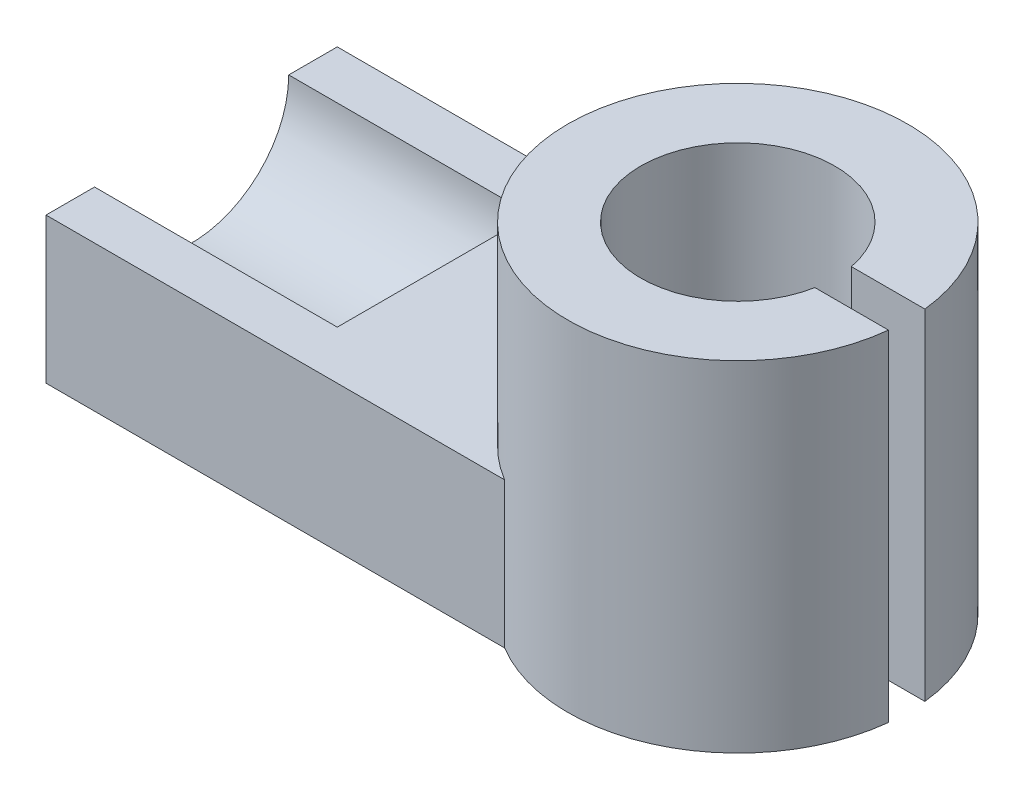
ISO-10303-21;
HEADER;
FILE_DESCRIPTION(('STEP AP214'),'2;1');
FILE_NAME('part.step','',(''),(''),'','','');
FILE_SCHEMA(('AUTOMOTIVE_DESIGN { 1 0 10303 214 1 1 1 1 }'));
ENDSEC;
DATA;
#1=APPLICATION_CONTEXT('core data for automotive mechanical design processes');
#2=APPLICATION_PROTOCOL_DEFINITION('international standard','automotive_design',2000,#1);
#3=PRODUCT_CONTEXT('',#1,'mechanical');
#4=PRODUCT('Part','Part','',(#3));
#5=PRODUCT_RELATED_PRODUCT_CATEGORY('part','',(#4));
#6=PRODUCT_DEFINITION_FORMATION('','',#4);
#7=PRODUCT_DEFINITION_CONTEXT('part definition',#1,'design');
#8=PRODUCT_DEFINITION('design','',#6,#7);
#9=PRODUCT_DEFINITION_SHAPE('','',#8);
#10=(LENGTH_UNIT() NAMED_UNIT(*) SI_UNIT(.MILLI.,.METRE.));
#11=(NAMED_UNIT(*) PLANE_ANGLE_UNIT() SI_UNIT($,.RADIAN.));
#12=(NAMED_UNIT(*) SI_UNIT($,.STERADIAN.) SOLID_ANGLE_UNIT());
#13=UNCERTAINTY_MEASURE_WITH_UNIT(LENGTH_MEASURE(1.E-05),#10,'distance_accuracy_value','');
#14=(GEOMETRIC_REPRESENTATION_CONTEXT(3) GLOBAL_UNCERTAINTY_ASSIGNED_CONTEXT((#13)) GLOBAL_UNIT_ASSIGNED_CONTEXT((#10,
#11,#12)) REPRESENTATION_CONTEXT('',''));
#15=CARTESIAN_POINT('',(0.,0.,0.));
#16=DIRECTION('',(0.,0.,1.));
#17=DIRECTION('',(1.,0.,0.));
#18=AXIS2_PLACEMENT_3D('',#15,#16,#17);
#19=CARTESIAN_POINT('',(0.,56.,-3.));
#20=DIRECTION('',(0.,0.,-1.));
#21=DIRECTION('',(-1.,0.,0.));
#22=AXIS2_PLACEMENT_3D('',#19,#20,#21);
#23=PLANE('',#22);
#24=DIRECTION('',(1.,0.,0.));
#25=VECTOR('',#24,1.);
#26=CARTESIAN_POINT('',(0.,0.,-3.));
#27=LINE('',#26,#25);
#28=CARTESIAN_POINT('',(15.7162336455017,0.,-3.));
#29=VERTEX_POINT('',#28);
#30=CARTESIAN_POINT('',(27.8388218141501,0.,-3.));
#31=VERTEX_POINT('',#30);
#32=EDGE_CURVE('E148',#29,#31,#27,.T.);
#33=ORIENTED_EDGE('',*,*,#32,.T.);
#34=DIRECTION('',(0.,-1.,0.));
#35=VECTOR('',#34,1.);
#36=CARTESIAN_POINT('',(27.8388218141501,56.,-3.));
#37=LINE('',#36,#35);
#38=CARTESIAN_POINT('',(27.8388218141501,56.,-3.));
#39=VERTEX_POINT('',#38);
#40=EDGE_CURVE('E183',#39,#31,#37,.T.);
#41=ORIENTED_EDGE('',*,*,#40,.F.);
#42=DIRECTION('',(1.,0.,0.));
#43=VECTOR('',#42,1.);
#44=CARTESIAN_POINT('',(0.,56.,-3.));
#45=LINE('',#44,#43);
#46=CARTESIAN_POINT('',(15.7162336455017,56.,-3.));
#47=VERTEX_POINT('',#46);
#48=EDGE_CURVE('E154',#47,#39,#45,.T.);
#49=ORIENTED_EDGE('',*,*,#48,.F.);
#50=DIRECTION('',(0.,-1.,0.));
#51=VECTOR('',#50,1.);
#52=CARTESIAN_POINT('',(15.7162336455017,56.,-3.));
#53=LINE('',#52,#51);
#54=EDGE_CURVE('E166',#47,#29,#53,.T.);
#55=ORIENTED_EDGE('',*,*,#54,.T.);
#56=EDGE_LOOP('',(#33,#41,#49,#55));
#57=FACE_BOUND('',#56,.T.);
#58=ADVANCED_FACE('F33',(#57),#23,.F.);
#59=CARTESIAN_POINT('',(0.,56.,0.));
#60=DIRECTION('',(0.,-1.,0.));
#61=DIRECTION('',(0.,0.,-1.));
#62=AXIS2_PLACEMENT_3D('',#59,#60,#61);
#63=CYLINDRICAL_SURFACE('',#62,28.);
#64=CARTESIAN_POINT('',(0.,24.,0.));
#65=DIRECTION('',(0.,1.,0.));
#66=DIRECTION('',(0.,0.,-1.));
#67=AXIS2_PLACEMENT_3D('',#64,#65,#66);
#68=CIRCLE('',#67,28.);
#69=CARTESIAN_POINT('',(-14.4222051018559,24.,-24.));
#70=VERTEX_POINT('',#69);
#71=CARTESIAN_POINT('',(-14.4222051018559,24.,24.));
#72=VERTEX_POINT('',#71);
#73=EDGE_CURVE('E130',#70,#72,#68,.T.);
#74=ORIENTED_EDGE('',*,*,#73,.T.);
#75=DIRECTION('',(0.,-1.,0.));
#76=VECTOR('',#75,1.);
#77=CARTESIAN_POINT('',(-14.4222051018559,24.,24.));
#78=LINE('',#77,#76);
#79=CARTESIAN_POINT('',(-14.4222051018559,0.,24.));
#80=VERTEX_POINT('',#79);
#81=EDGE_CURVE('E149',#72,#80,#78,.T.);
#82=ORIENTED_EDGE('',*,*,#81,.T.);
#83=CARTESIAN_POINT('',(0.,0.,0.));
#84=DIRECTION('',(0.,1.,0.));
#85=DIRECTION('',(0.,0.,1.));
#86=AXIS2_PLACEMENT_3D('',#83,#84,#85);
#87=CIRCLE('',#86,28.);
#88=CARTESIAN_POINT('',(27.8388218141501,0.,3.));
#89=VERTEX_POINT('',#88);
#90=EDGE_CURVE('E169',#80,#89,#87,.T.);
#91=ORIENTED_EDGE('',*,*,#90,.T.);
#92=DIRECTION('',(0.,-1.,0.));
#93=VECTOR('',#92,1.);
#94=CARTESIAN_POINT('',(27.8388218141501,56.,3.));
#95=LINE('',#94,#93);
#96=CARTESIAN_POINT('',(27.8388218141501,56.,3.));
#97=VERTEX_POINT('',#96);
#98=EDGE_CURVE('E180',#97,#89,#95,.T.);
#99=ORIENTED_EDGE('',*,*,#98,.F.);
#100=CARTESIAN_POINT('',(0.,56.,0.));
#101=DIRECTION('',(0.,1.,0.));
#102=DIRECTION('',(0.,0.,1.));
#103=AXIS2_PLACEMENT_3D('',#100,#101,#102);
#104=CIRCLE('',#103,28.);
#105=EDGE_CURVE('E157',#39,#97,#104,.T.);
#106=ORIENTED_EDGE('',*,*,#105,.F.);
#107=ORIENTED_EDGE('',*,*,#40,.T.);
#108=CARTESIAN_POINT('',(-14.4222051018559,0.,-24.));
#109=VERTEX_POINT('',#108);
#110=EDGE_CURVE('E170',#31,#109,#87,.T.);
#111=ORIENTED_EDGE('',*,*,#110,.T.);
#112=DIRECTION('',(0.,-1.,0.));
#113=VECTOR('',#112,1.);
#114=CARTESIAN_POINT('',(-14.4222051018559,24.,-24.));
#115=LINE('',#114,#113);
#116=EDGE_CURVE('E54',#70,#109,#115,.T.);
#117=ORIENTED_EDGE('',*,*,#116,.F.);
#118=EDGE_LOOP('',(#74,#82,#91,#99,#106,#107,#111,#117));
#119=FACE_BOUND('',#118,.T.);
#120=ADVANCED_FACE('F198',(#119),#63,.T.);
#121=CARTESIAN_POINT('',(0.,56.,3.));
#122=DIRECTION('',(0.,0.,-1.));
#123=DIRECTION('',(-1.,0.,0.));
#124=AXIS2_PLACEMENT_3D('',#121,#122,#123);
#125=PLANE('',#124);
#126=DIRECTION('',(1.,0.,0.));
#127=VECTOR('',#126,1.);
#128=CARTESIAN_POINT('',(0.,0.,3.));
#129=LINE('',#128,#127);
#130=CARTESIAN_POINT('',(15.7162336455017,0.,3.));
#131=VERTEX_POINT('',#130);
#132=EDGE_CURVE('E172',#131,#89,#129,.T.);
#133=ORIENTED_EDGE('',*,*,#132,.F.);
#134=DIRECTION('',(0.,-1.,0.));
#135=VECTOR('',#134,1.);
#136=CARTESIAN_POINT('',(15.7162336455017,56.,3.));
#137=LINE('',#136,#135);
#138=CARTESIAN_POINT('',(15.7162336455017,56.,3.));
#139=VERTEX_POINT('',#138);
#140=EDGE_CURVE('E178',#139,#131,#137,.T.);
#141=ORIENTED_EDGE('',*,*,#140,.F.);
#142=DIRECTION('',(1.,0.,0.));
#143=VECTOR('',#142,1.);
#144=CARTESIAN_POINT('',(0.,56.,3.));
#145=LINE('',#144,#143);
#146=EDGE_CURVE('E160',#139,#97,#145,.T.);
#147=ORIENTED_EDGE('',*,*,#146,.T.);
#148=ORIENTED_EDGE('',*,*,#98,.T.);
#149=EDGE_LOOP('',(#133,#141,#147,#148));
#150=FACE_BOUND('',#149,.T.);
#151=ADVANCED_FACE('F202',(#150),#125,.T.);
#152=CARTESIAN_POINT('',(0.,56.,0.));
#153=DIRECTION('',(0.,-1.,0.));
#154=DIRECTION('',(0.,0.,-1.));
#155=AXIS2_PLACEMENT_3D('',#152,#153,#154);
#156=CYLINDRICAL_SURFACE('',#155,16.);
#157=CARTESIAN_POINT('',(0.,0.,0.));
#158=DIRECTION('',(0.,1.,0.));
#159=DIRECTION('',(0.,0.,1.));
#160=AXIS2_PLACEMENT_3D('',#157,#158,#159);
#161=CIRCLE('',#160,16.);
#162=EDGE_CURVE('E158',#29,#131,#161,.T.);
#163=ORIENTED_EDGE('',*,*,#162,.F.);
#164=ORIENTED_EDGE('',*,*,#54,.F.);
#165=CARTESIAN_POINT('',(0.,56.,0.));
#166=DIRECTION('',(0.,1.,0.));
#167=DIRECTION('',(0.,0.,1.));
#168=AXIS2_PLACEMENT_3D('',#165,#166,#167);
#169=CIRCLE('',#168,16.);
#170=EDGE_CURVE('E163',#47,#139,#169,.T.);
#171=ORIENTED_EDGE('',*,*,#170,.T.);
#172=ORIENTED_EDGE('',*,*,#140,.T.);
#173=EDGE_LOOP('',(#163,#164,#171,#172));
#174=FACE_BOUND('',#173,.T.);
#175=ADVANCED_FACE('F206',(#174),#156,.F.);
#176=CARTESIAN_POINT('',(0.,56.,0.));
#177=DIRECTION('',(0.,1.,0.));
#178=DIRECTION('',(0.,0.,1.));
#179=AXIS2_PLACEMENT_3D('',#176,#177,#178);
#180=PLANE('',#179);
#181=ORIENTED_EDGE('',*,*,#48,.T.);
#182=ORIENTED_EDGE('',*,*,#105,.T.);
#183=ORIENTED_EDGE('',*,*,#146,.F.);
#184=ORIENTED_EDGE('',*,*,#170,.F.);
#185=EDGE_LOOP('',(#181,#182,#183,#184));
#186=FACE_BOUND('',#185,.T.);
#187=ADVANCED_FACE('F210',(#186),#180,.T.);
#188=CARTESIAN_POINT('',(0.,0.,0.));
#189=DIRECTION('',(0.,1.,0.));
#190=DIRECTION('',(0.,0.,1.));
#191=AXIS2_PLACEMENT_3D('',#188,#189,#190);
#192=PLANE('',#191);
#193=ORIENTED_EDGE('',*,*,#32,.F.);
#194=ORIENTED_EDGE('',*,*,#162,.T.);
#195=ORIENTED_EDGE('',*,*,#132,.T.);
#196=ORIENTED_EDGE('',*,*,#90,.F.);
#197=DIRECTION('',(-1.,0.,0.));
#198=VECTOR('',#197,1.);
#199=CARTESIAN_POINT('',(-90.,0.,24.));
#200=LINE('',#199,#198);
#201=CARTESIAN_POINT('',(-90.,0.,24.));
#202=VERTEX_POINT('',#201);
#203=EDGE_CURVE('E132',#80,#202,#200,.T.);
#204=ORIENTED_EDGE('',*,*,#203,.T.);
#205=DIRECTION('',(0.,0.,-1.));
#206=VECTOR('',#205,1.);
#207=CARTESIAN_POINT('',(-90.,0.,-24.));
#208=LINE('',#207,#206);
#209=CARTESIAN_POINT('',(-90.,0.,-24.));
#210=VERTEX_POINT('',#209);
#211=EDGE_CURVE('E139',#202,#210,#208,.T.);
#212=ORIENTED_EDGE('',*,*,#211,.T.);
#213=DIRECTION('',(1.,0.,0.));
#214=VECTOR('',#213,1.);
#215=CARTESIAN_POINT('',(-90.,0.,-24.));
#216=LINE('',#215,#214);
#217=EDGE_CURVE('E142',#210,#109,#216,.T.);
#218=ORIENTED_EDGE('',*,*,#217,.T.);
#219=ORIENTED_EDGE('',*,*,#110,.F.);
#220=EDGE_LOOP('',(#193,#194,#195,#196,#204,#212,#218,#219));
#221=FACE_BOUND('',#220,.T.);
#222=ADVANCED_FACE('F193',(#221),#192,.F.);
#223=CARTESIAN_POINT('',(-90.,24.,-24.));
#224=DIRECTION('',(-1.,0.,0.));
#225=DIRECTION('',(0.,0.,1.));
#226=AXIS2_PLACEMENT_3D('',#223,#224,#225);
#227=PLANE('',#226);
#228=CARTESIAN_POINT('',(-90.,24.,0.));
#229=DIRECTION('',(-1.,0.,0.));
#230=DIRECTION('',(0.,0.,1.));
#231=AXIS2_PLACEMENT_3D('',#228,#229,#230);
#232=CIRCLE('',#231,16.);
#233=CARTESIAN_POINT('',(-90.,24.,-16.));
#234=VERTEX_POINT('',#233);
#235=CARTESIAN_POINT('',(-90.,24.,16.));
#236=VERTEX_POINT('',#235);
#237=EDGE_CURVE('E108',#234,#236,#232,.T.);
#238=ORIENTED_EDGE('',*,*,#237,.F.);
#239=DIRECTION('',(0.,0.,-1.));
#240=VECTOR('',#239,1.);
#241=CARTESIAN_POINT('',(-90.,24.,-24.));
#242=LINE('',#241,#240);
#243=CARTESIAN_POINT('',(-90.,24.,-24.));
#244=VERTEX_POINT('',#243);
#245=EDGE_CURVE('E127',#234,#244,#242,.T.);
#246=ORIENTED_EDGE('',*,*,#245,.T.);
#247=DIRECTION('',(0.,-1.,0.));
#248=VECTOR('',#247,1.);
#249=CARTESIAN_POINT('',(-90.,24.,-24.));
#250=LINE('',#249,#248);
#251=EDGE_CURVE('E138',#244,#210,#250,.T.);
#252=ORIENTED_EDGE('',*,*,#251,.T.);
#253=ORIENTED_EDGE('',*,*,#211,.F.);
#254=DIRECTION('',(0.,-1.,0.));
#255=VECTOR('',#254,1.);
#256=CARTESIAN_POINT('',(-90.,24.,24.));
#257=LINE('',#256,#255);
#258=CARTESIAN_POINT('',(-90.,24.,24.));
#259=VERTEX_POINT('',#258);
#260=EDGE_CURVE('E125',#259,#202,#257,.T.);
#261=ORIENTED_EDGE('',*,*,#260,.F.);
#262=EDGE_CURVE('E120',#259,#236,#242,.T.);
#263=ORIENTED_EDGE('',*,*,#262,.T.);
#264=EDGE_LOOP('',(#238,#246,#252,#253,#261,#263));
#265=FACE_BOUND('',#264,.T.);
#266=ADVANCED_FACE('F123',(#265),#227,.T.);
#267=CARTESIAN_POINT('',(-90.,24.,24.));
#268=DIRECTION('',(0.,0.,1.));
#269=DIRECTION('',(1.,0.,0.));
#270=AXIS2_PLACEMENT_3D('',#267,#268,#269);
#271=PLANE('',#270);
#272=ORIENTED_EDGE('',*,*,#203,.F.);
#273=ORIENTED_EDGE('',*,*,#81,.F.);
#274=DIRECTION('',(-1.,0.,0.));
#275=VECTOR('',#274,1.);
#276=CARTESIAN_POINT('',(-90.,24.,24.));
#277=LINE('',#276,#275);
#278=EDGE_CURVE('E136',#72,#259,#277,.T.);
#279=ORIENTED_EDGE('',*,*,#278,.T.);
#280=ORIENTED_EDGE('',*,*,#260,.T.);
#281=EDGE_LOOP('',(#272,#273,#279,#280));
#282=FACE_BOUND('',#281,.T.);
#283=ADVANCED_FACE('F197',(#282),#271,.T.);
#284=CARTESIAN_POINT('',(-90.,24.,-24.));
#285=DIRECTION('',(0.,0.,-1.));
#286=DIRECTION('',(-1.,0.,0.));
#287=AXIS2_PLACEMENT_3D('',#284,#285,#286);
#288=PLANE('',#287);
#289=ORIENTED_EDGE('',*,*,#217,.F.);
#290=ORIENTED_EDGE('',*,*,#251,.F.);
#291=DIRECTION('',(1.,0.,0.));
#292=VECTOR('',#291,1.);
#293=CARTESIAN_POINT('',(-90.,24.,-24.));
#294=LINE('',#293,#292);
#295=EDGE_CURVE('E126',#244,#70,#294,.T.);
#296=ORIENTED_EDGE('',*,*,#295,.T.);
#297=ORIENTED_EDGE('',*,*,#116,.T.);
#298=EDGE_LOOP('',(#289,#290,#296,#297));
#299=FACE_BOUND('',#298,.T.);
#300=ADVANCED_FACE('F190',(#299),#288,.T.);
#301=CARTESIAN_POINT('',(0.,24.,0.));
#302=DIRECTION('',(0.,-1.,0.));
#303=DIRECTION('',(0.,0.,-1.));
#304=AXIS2_PLACEMENT_3D('',#301,#302,#303);
#305=PLANE('',#304);
#306=DIRECTION('',(0.,0.,-1.));
#307=VECTOR('',#306,1.);
#308=CARTESIAN_POINT('',(-50.,24.,0.));
#309=LINE('',#308,#307);
#310=CARTESIAN_POINT('',(-50.,24.,16.));
#311=VERTEX_POINT('',#310);
#312=CARTESIAN_POINT('',(-50.,24.,-16.));
#313=VERTEX_POINT('',#312);
#314=EDGE_CURVE('E122',#311,#313,#309,.T.);
#315=ORIENTED_EDGE('',*,*,#314,.F.);
#316=DIRECTION('',(-1.,0.,0.));
#317=VECTOR('',#316,1.);
#318=CARTESIAN_POINT('',(-50.,24.,16.));
#319=LINE('',#318,#317);
#320=EDGE_CURVE('E11',#311,#236,#319,.T.);
#321=ORIENTED_EDGE('',*,*,#320,.T.);
#322=ORIENTED_EDGE('',*,*,#262,.F.);
#323=ORIENTED_EDGE('',*,*,#278,.F.);
#324=ORIENTED_EDGE('',*,*,#73,.F.);
#325=ORIENTED_EDGE('',*,*,#295,.F.);
#326=ORIENTED_EDGE('',*,*,#245,.F.);
#327=DIRECTION('',(-1.,0.,0.));
#328=VECTOR('',#327,1.);
#329=CARTESIAN_POINT('',(-50.,24.,-16.));
#330=LINE('',#329,#328);
#331=EDGE_CURVE('E40',#234,#313,#330,.F.);
#332=ORIENTED_EDGE('',*,*,#331,.T.);
#333=EDGE_LOOP('',(#315,#321,#322,#323,#324,#325,#326,#332));
#334=FACE_BOUND('',#333,.T.);
#335=ADVANCED_FACE('F118',(#334),#305,.F.);
#336=CARTESIAN_POINT('',(-50.,24.,0.));
#337=DIRECTION('',(-1.,0.,0.));
#338=DIRECTION('',(0.,0.,1.));
#339=AXIS2_PLACEMENT_3D('',#336,#337,#338);
#340=CYLINDRICAL_SURFACE('',#339,16.);
#341=CARTESIAN_POINT('',(-50.,24.,0.));
#342=DIRECTION('',(-1.,0.,0.));
#343=DIRECTION('',(0.,0.,1.));
#344=AXIS2_PLACEMENT_3D('',#341,#342,#343);
#345=CIRCLE('',#344,16.);
#346=EDGE_CURVE('E46',#313,#311,#345,.T.);
#347=ORIENTED_EDGE('',*,*,#346,.F.);
#348=ORIENTED_EDGE('',*,*,#331,.F.);
#349=ORIENTED_EDGE('',*,*,#237,.T.);
#350=ORIENTED_EDGE('',*,*,#320,.F.);
#351=EDGE_LOOP('',(#347,#348,#349,#350));
#352=FACE_BOUND('',#351,.T.);
#353=ADVANCED_FACE('F109',(#352),#340,.F.);
#354=CARTESIAN_POINT('',(-50.,24.,0.));
#355=DIRECTION('',(-1.,0.,0.));
#356=DIRECTION('',(0.,0.,1.));
#357=AXIS2_PLACEMENT_3D('',#354,#355,#356);
#358=PLANE('',#357);
#359=ORIENTED_EDGE('',*,*,#314,.T.);
#360=ORIENTED_EDGE('',*,*,#346,.T.);
#361=EDGE_LOOP('',(#359,#360));
#362=FACE_BOUND('',#361,.T.);
#363=ADVANCED_FACE('F238',(#362),#358,.T.);
#364=CLOSED_SHELL('',(#58,#120,#151,#175,#187,#222,#266,#283,#300,#335,#353,#363));
#365=MANIFOLD_SOLID_BREP('B2',#364);
#366=ADVANCED_BREP_SHAPE_REPRESENTATION('',(#18,#365),#14);
#367=SHAPE_DEFINITION_REPRESENTATION(#9,#366);
ENDSEC;
END-ISO-10303-21;
